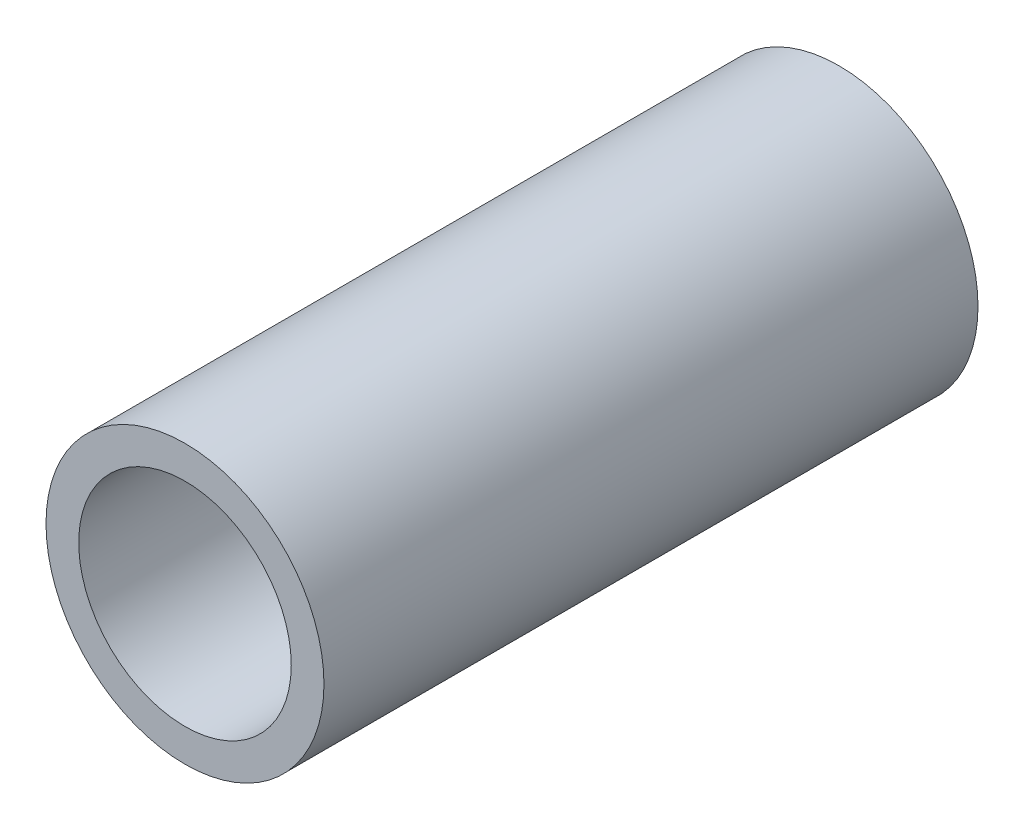
ISO-10303-21;
HEADER;
FILE_DESCRIPTION(('STEP AP214'),'2;1');
FILE_NAME('part.step','',(''),(''),'','','');
FILE_SCHEMA(('AUTOMOTIVE_DESIGN { 1 0 10303 214 1 1 1 1 }'));
ENDSEC;
DATA;
#1=APPLICATION_CONTEXT('core data for automotive mechanical design processes');
#2=APPLICATION_PROTOCOL_DEFINITION('international standard','automotive_design',2000,#1);
#3=PRODUCT_CONTEXT('',#1,'mechanical');
#4=PRODUCT('Part','Part','',(#3));
#5=PRODUCT_RELATED_PRODUCT_CATEGORY('part','',(#4));
#6=PRODUCT_DEFINITION_FORMATION('','',#4);
#7=PRODUCT_DEFINITION_CONTEXT('part definition',#1,'design');
#8=PRODUCT_DEFINITION('design','',#6,#7);
#9=PRODUCT_DEFINITION_SHAPE('','',#8);
#10=(LENGTH_UNIT() NAMED_UNIT(*) SI_UNIT(.MILLI.,.METRE.));
#11=(NAMED_UNIT(*) PLANE_ANGLE_UNIT() SI_UNIT($,.RADIAN.));
#12=(NAMED_UNIT(*) SI_UNIT($,.STERADIAN.) SOLID_ANGLE_UNIT());
#13=UNCERTAINTY_MEASURE_WITH_UNIT(LENGTH_MEASURE(1.E-05),#10,'distance_accuracy_value','');
#14=(GEOMETRIC_REPRESENTATION_CONTEXT(3) GLOBAL_UNCERTAINTY_ASSIGNED_CONTEXT((#13)) GLOBAL_UNIT_ASSIGNED_CONTEXT((#10,
#11,#12)) REPRESENTATION_CONTEXT('',''));
#15=CARTESIAN_POINT('',(0.,0.,0.));
#16=DIRECTION('',(0.,0.,1.));
#17=DIRECTION('',(1.,0.,0.));
#18=AXIS2_PLACEMENT_3D('',#15,#16,#17);
#19=CARTESIAN_POINT('',(0.,0.,80.));
#20=DIRECTION('',(0.,0.,1.));
#21=DIRECTION('',(1.,0.,0.));
#22=AXIS2_PLACEMENT_3D('',#19,#20,#21);
#23=PLANE('',#22);
#24=CARTESIAN_POINT('',(0.,0.,80.));
#25=DIRECTION('',(0.,0.,1.));
#26=DIRECTION('',(1.,0.,0.));
#27=AXIS2_PLACEMENT_3D('',#24,#25,#26);
#28=CIRCLE('',#27,17.);
#29=CARTESIAN_POINT('',(17.,0.,80.));
#30=VERTEX_POINT('',#29);
#31=EDGE_CURVE('E10',#30,#30,#28,.T.);
#32=ORIENTED_EDGE('',*,*,#31,.T.);
#33=EDGE_LOOP('',(#32));
#34=FACE_BOUND('',#33,.T.);
#35=CARTESIAN_POINT('',(0.,0.,80.));
#36=DIRECTION('',(0.,0.,1.));
#37=DIRECTION('',(1.,0.,0.));
#38=AXIS2_PLACEMENT_3D('',#35,#36,#37);
#39=CIRCLE('',#38,13.);
#40=CARTESIAN_POINT('',(13.,0.,80.));
#41=VERTEX_POINT('',#40);
#42=EDGE_CURVE('E39',#41,#41,#39,.T.);
#43=ORIENTED_EDGE('',*,*,#42,.F.);
#44=EDGE_LOOP('',(#43));
#45=FACE_BOUND('',#44,.T.);
#46=ADVANCED_FACE('F28',(#34,#45),#23,.T.);
#47=CARTESIAN_POINT('',(0.,0.,0.));
#48=DIRECTION('',(0.,0.,1.));
#49=DIRECTION('',(1.,0.,0.));
#50=AXIS2_PLACEMENT_3D('',#47,#48,#49);
#51=PLANE('',#50);
#52=CARTESIAN_POINT('',(0.,0.,0.));
#53=DIRECTION('',(0.,0.,1.));
#54=DIRECTION('',(1.,0.,0.));
#55=AXIS2_PLACEMENT_3D('',#52,#53,#54);
#56=CIRCLE('',#55,17.);
#57=CARTESIAN_POINT('',(17.,0.,0.));
#58=VERTEX_POINT('',#57);
#59=EDGE_CURVE('E32',#58,#58,#56,.T.);
#60=ORIENTED_EDGE('',*,*,#59,.F.);
#61=EDGE_LOOP('',(#60));
#62=FACE_BOUND('',#61,.T.);
#63=CARTESIAN_POINT('',(0.,0.,0.));
#64=DIRECTION('',(0.,0.,1.));
#65=DIRECTION('',(1.,0.,0.));
#66=AXIS2_PLACEMENT_3D('',#63,#64,#65);
#67=CIRCLE('',#66,13.);
#68=CARTESIAN_POINT('',(13.,0.,0.));
#69=VERTEX_POINT('',#68);
#70=EDGE_CURVE('E41',#69,#69,#67,.T.);
#71=ORIENTED_EDGE('',*,*,#70,.T.);
#72=EDGE_LOOP('',(#71));
#73=FACE_BOUND('',#72,.T.);
#74=ADVANCED_FACE('F51',(#62,#73),#51,.F.);
#75=CARTESIAN_POINT('',(0.,0.,80.));
#76=DIRECTION('',(0.,0.,-1.));
#77=DIRECTION('',(-1.,0.,0.));
#78=AXIS2_PLACEMENT_3D('',#75,#76,#77);
#79=CYLINDRICAL_SURFACE('',#78,17.);
#80=ORIENTED_EDGE('',*,*,#31,.F.);
#81=EDGE_LOOP('',(#80));
#82=FACE_BOUND('',#81,.T.);
#83=ORIENTED_EDGE('',*,*,#59,.T.);
#84=EDGE_LOOP('',(#83));
#85=FACE_BOUND('',#84,.T.);
#86=ADVANCED_FACE('F30',(#82,#85),#79,.T.);
#87=CARTESIAN_POINT('',(0.,0.,80.));
#88=DIRECTION('',(0.,0.,-1.));
#89=DIRECTION('',(-1.,0.,0.));
#90=AXIS2_PLACEMENT_3D('',#87,#88,#89);
#91=CYLINDRICAL_SURFACE('',#90,13.);
#92=ORIENTED_EDGE('',*,*,#42,.T.);
#93=EDGE_LOOP('',(#92));
#94=FACE_BOUND('',#93,.T.);
#95=ORIENTED_EDGE('',*,*,#70,.F.);
#96=EDGE_LOOP('',(#95));
#97=FACE_BOUND('',#96,.T.);
#98=ADVANCED_FACE('F47',(#94,#97),#91,.F.);
#99=CLOSED_SHELL('',(#46,#74,#86,#98));
#100=MANIFOLD_SOLID_BREP('B2',#99);
#101=ADVANCED_BREP_SHAPE_REPRESENTATION('',(#18,#100),#14);
#102=SHAPE_DEFINITION_REPRESENTATION(#9,#101);
ENDSEC;
END-ISO-10303-21;
